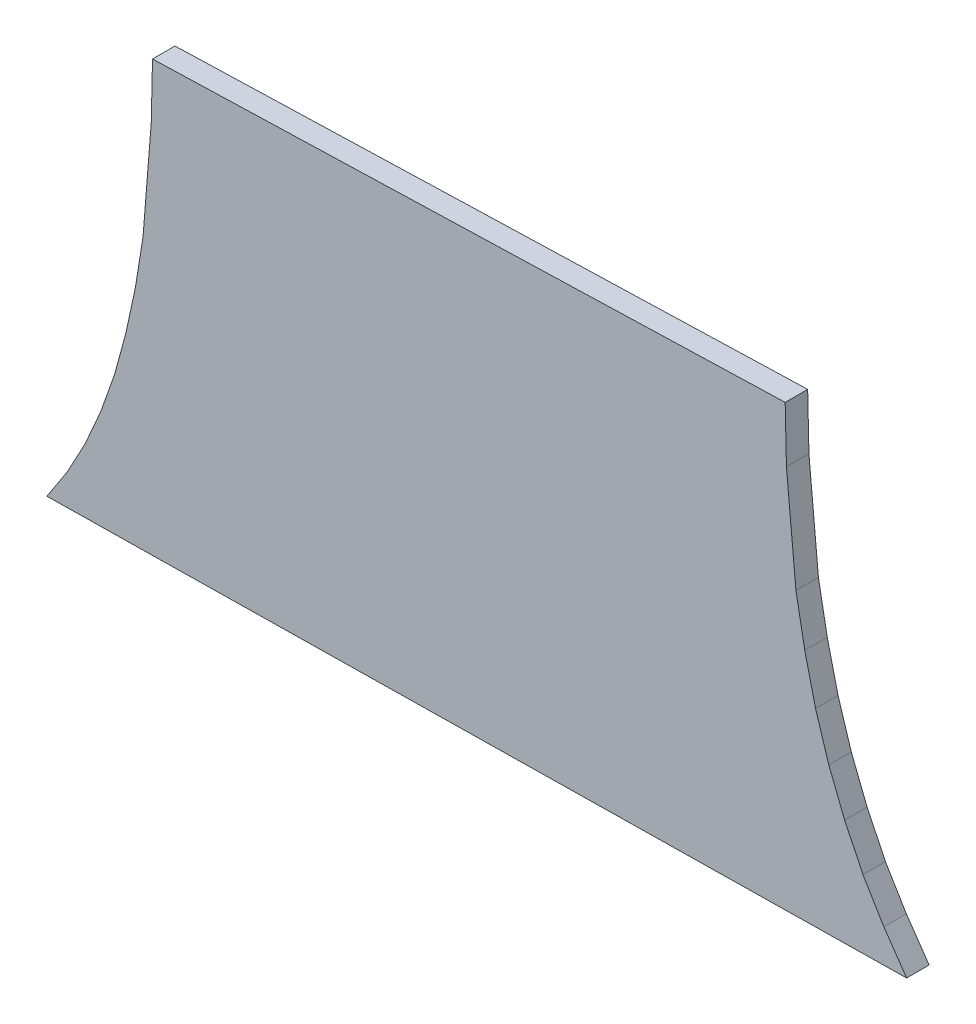
ISO-10303-21;
HEADER;
FILE_DESCRIPTION(('STEP AP214'),'2;1');
FILE_NAME('part.step','',(''),(''),'','','');
FILE_SCHEMA(('AUTOMOTIVE_DESIGN { 1 0 10303 214 1 1 1 1 }'));
ENDSEC;
DATA;
#1=APPLICATION_CONTEXT('core data for automotive mechanical design processes');
#2=APPLICATION_PROTOCOL_DEFINITION('international standard','automotive_design',2000,#1);
#3=PRODUCT_CONTEXT('',#1,'mechanical');
#4=PRODUCT('Part','Part','',(#3));
#5=PRODUCT_RELATED_PRODUCT_CATEGORY('part','',(#4));
#6=PRODUCT_DEFINITION_FORMATION('','',#4);
#7=PRODUCT_DEFINITION_CONTEXT('part definition',#1,'design');
#8=PRODUCT_DEFINITION('design','',#6,#7);
#9=PRODUCT_DEFINITION_SHAPE('','',#8);
#10=(LENGTH_UNIT() NAMED_UNIT(*) SI_UNIT(.MILLI.,.METRE.));
#11=(NAMED_UNIT(*) PLANE_ANGLE_UNIT() SI_UNIT($,.RADIAN.));
#12=(NAMED_UNIT(*) SI_UNIT($,.STERADIAN.) SOLID_ANGLE_UNIT());
#13=UNCERTAINTY_MEASURE_WITH_UNIT(LENGTH_MEASURE(1.E-05),#10,'distance_accuracy_value','');
#14=(GEOMETRIC_REPRESENTATION_CONTEXT(3) GLOBAL_UNCERTAINTY_ASSIGNED_CONTEXT((#13)) GLOBAL_UNIT_ASSIGNED_CONTEXT((#10,
#11,#12)) REPRESENTATION_CONTEXT('',''));
#15=CARTESIAN_POINT('',(0.,0.,0.));
#16=DIRECTION('',(0.,0.,1.));
#17=DIRECTION('',(1.,0.,0.));
#18=AXIS2_PLACEMENT_3D('',#15,#16,#17);
#19=CARTESIAN_POINT('',(56.9000015258789,63.7820014953613,0.));
#20=DIRECTION('',(0.999741141508267,-0.0227519224626919,0.));
#21=DIRECTION('',(-0.0227519224626919,-0.999741141508267,0.));
#22=AXIS2_PLACEMENT_3D('',#19,#20,#21);
#23=PLANE('',#22);
#24=DIRECTION('',(-0.0227519224626919,-0.999741141508266,0.));
#25=VECTOR('',#24,1.);
#26=CARTESIAN_POINT('',(56.9000015258789,63.7820014953613,0.03556));
#27=LINE('',#26,#25);
#28=CARTESIAN_POINT('',(56.9000015258789,63.7820014953613,0.03556));
#29=VERTEX_POINT('',#28);
#30=CARTESIAN_POINT('',(56.8979988098145,63.6940002441406,0.03556));
#31=VERTEX_POINT('',#30);
#32=EDGE_CURVE('E11',#29,#31,#27,.T.);
#33=ORIENTED_EDGE('',*,*,#32,.F.);
#34=DIRECTION('',(0.,0.,1.));
#35=VECTOR('',#34,1.);
#36=CARTESIAN_POINT('',(56.9000015258789,63.7820014953613,0.));
#37=LINE('',#36,#35);
#38=CARTESIAN_POINT('',(56.9000015258789,63.7820014953613,0.));
#39=VERTEX_POINT('',#38);
#40=EDGE_CURVE('E24',#39,#29,#37,.T.);
#41=ORIENTED_EDGE('',*,*,#40,.F.);
#42=DIRECTION('',(-0.0227519224626919,-0.999741141508266,0.));
#43=VECTOR('',#42,1.);
#44=CARTESIAN_POINT('',(56.9000015258789,63.7820014953613,0.));
#45=LINE('',#44,#43);
#46=CARTESIAN_POINT('',(56.8979988098145,63.6940002441406,0.));
#47=VERTEX_POINT('',#46);
#48=EDGE_CURVE('E172',#39,#47,#45,.T.);
#49=ORIENTED_EDGE('',*,*,#48,.T.);
#50=DIRECTION('',(0.,0.,1.));
#51=VECTOR('',#50,1.);
#52=CARTESIAN_POINT('',(56.8979988098145,63.6940002441406,0.));
#53=LINE('',#52,#51);
#54=EDGE_CURVE('E37',#47,#31,#53,.T.);
#55=ORIENTED_EDGE('',*,*,#54,.T.);
#56=EDGE_LOOP('',(#33,#41,#49,#55));
#57=FACE_BOUND('',#56,.T.);
#58=ADVANCED_FACE('F17',(#57),#23,.F.);
#59=CARTESIAN_POINT('',(56.8979988098145,63.6940002441406,0.));
#60=DIRECTION('',(0.996834535416527,-0.0795041445518259,0.));
#61=DIRECTION('',(-0.0795041445518259,-0.996834535416527,0.));
#62=AXIS2_PLACEMENT_3D('',#59,#60,#61);
#63=PLANE('',#62);
#64=DIRECTION('',(-0.0795041445518259,-0.996834535416526,0.));
#65=VECTOR('',#64,1.);
#66=CARTESIAN_POINT('',(56.8979988098145,63.6940002441406,0.03556));
#67=LINE('',#66,#65);
#68=CARTESIAN_POINT('',(56.8849983215332,63.5309982299805,0.03556));
#69=VERTEX_POINT('',#68);
#70=EDGE_CURVE('E308',#31,#69,#67,.T.);
#71=ORIENTED_EDGE('',*,*,#70,.F.);
#72=ORIENTED_EDGE('',*,*,#54,.F.);
#73=DIRECTION('',(-0.0795041445518259,-0.996834535416526,0.));
#74=VECTOR('',#73,1.);
#75=CARTESIAN_POINT('',(56.8979988098145,63.6940002441406,0.));
#76=LINE('',#75,#74);
#77=CARTESIAN_POINT('',(56.8849983215332,63.5309982299805,0.));
#78=VERTEX_POINT('',#77);
#79=EDGE_CURVE('E305',#47,#78,#76,.T.);
#80=ORIENTED_EDGE('',*,*,#79,.T.);
#81=DIRECTION('',(0.,0.,1.));
#82=VECTOR('',#81,1.);
#83=CARTESIAN_POINT('',(56.8849983215332,63.5309982299805,0.));
#84=LINE('',#83,#82);
#85=EDGE_CURVE('E303',#78,#69,#84,.T.);
#86=ORIENTED_EDGE('',*,*,#85,.T.);
#87=EDGE_LOOP('',(#71,#72,#80,#86));
#88=FACE_BOUND('',#87,.T.);
#89=ADVANCED_FACE('F316',(#88),#63,.F.);
#90=CARTESIAN_POINT('',(56.8849983215332,63.5309982299805,0.));
#91=DIRECTION('',(0.98744533283152,-0.157961117586731,0.));
#92=DIRECTION('',(-0.157961117586731,-0.98744533283152,0.));
#93=AXIS2_PLACEMENT_3D('',#90,#91,#92);
#94=PLANE('',#93);
#95=DIRECTION('',(-0.157961117586731,-0.98744533283152,0.));
#96=VECTOR('',#95,1.);
#97=CARTESIAN_POINT('',(56.8849983215332,63.5309982299805,0.03556));
#98=LINE('',#97,#96);
#99=CARTESIAN_POINT('',(56.8730010986328,63.4560012817383,0.03556));
#100=VERTEX_POINT('',#99);
#101=EDGE_CURVE('E300',#69,#100,#98,.T.);
#102=ORIENTED_EDGE('',*,*,#101,.F.);
#103=ORIENTED_EDGE('',*,*,#85,.F.);
#104=DIRECTION('',(-0.157961117586731,-0.98744533283152,0.));
#105=VECTOR('',#104,1.);
#106=CARTESIAN_POINT('',(56.8849983215332,63.5309982299805,0.));
#107=LINE('',#106,#105);
#108=CARTESIAN_POINT('',(56.8730010986328,63.4560012817383,0.));
#109=VERTEX_POINT('',#108);
#110=EDGE_CURVE('E297',#78,#109,#107,.T.);
#111=ORIENTED_EDGE('',*,*,#110,.T.);
#112=DIRECTION('',(0.,0.,1.));
#113=VECTOR('',#112,1.);
#114=CARTESIAN_POINT('',(56.8730010986328,63.4560012817383,0.));
#115=LINE('',#114,#113);
#116=EDGE_CURVE('E295',#109,#100,#115,.T.);
#117=ORIENTED_EDGE('',*,*,#116,.T.);
#118=EDGE_LOOP('',(#102,#103,#111,#117));
#119=FACE_BOUND('',#118,.T.);
#120=ADVANCED_FACE('F322',(#119),#94,.F.);
#121=CARTESIAN_POINT('',(56.8730010986328,63.4560012817383,0.));
#122=DIRECTION('',(0.977803973649935,-0.209521810593545,0.));
#123=DIRECTION('',(-0.209521810593545,-0.977803973649935,0.));
#124=AXIS2_PLACEMENT_3D('',#121,#122,#123);
#125=PLANE('',#124);
#126=DIRECTION('',(-0.209521810593545,-0.977803973649935,0.));
#127=VECTOR('',#126,1.);
#128=CARTESIAN_POINT('',(56.8730010986328,63.4560012817383,0.03556));
#129=LINE('',#128,#127);
#130=CARTESIAN_POINT('',(56.8580017089844,63.3860015869141,0.03556));
#131=VERTEX_POINT('',#130);
#132=EDGE_CURVE('E292',#100,#131,#129,.T.);
#133=ORIENTED_EDGE('',*,*,#132,.F.);
#134=ORIENTED_EDGE('',*,*,#116,.F.);
#135=DIRECTION('',(-0.209521810593545,-0.977803973649935,0.));
#136=VECTOR('',#135,1.);
#137=CARTESIAN_POINT('',(56.8730010986328,63.4560012817383,0.));
#138=LINE('',#137,#136);
#139=CARTESIAN_POINT('',(56.8580017089844,63.3860015869141,0.));
#140=VERTEX_POINT('',#139);
#141=EDGE_CURVE('E289',#109,#140,#138,.T.);
#142=ORIENTED_EDGE('',*,*,#141,.T.);
#143=DIRECTION('',(0.,0.,1.));
#144=VECTOR('',#143,1.);
#145=CARTESIAN_POINT('',(56.8580017089844,63.3860015869141,0.));
#146=LINE('',#145,#144);
#147=EDGE_CURVE('E287',#140,#131,#146,.T.);
#148=ORIENTED_EDGE('',*,*,#147,.T.);
#149=EDGE_LOOP('',(#133,#134,#142,#148));
#150=FACE_BOUND('',#149,.T.);
#151=ADVANCED_FACE('F324',(#150),#125,.F.);
#152=CARTESIAN_POINT('',(56.8580017089844,63.3860015869141,0.));
#153=DIRECTION('',(0.964759960824443,-0.263131560231797,0.));
#154=DIRECTION('',(-0.263131560231797,-0.964759960824443,0.));
#155=AXIS2_PLACEMENT_3D('',#152,#153,#154);
#156=PLANE('',#155);
#157=DIRECTION('',(-0.263131560231797,-0.964759960824443,0.));
#158=VECTOR('',#157,1.);
#159=CARTESIAN_POINT('',(56.8580017089844,63.3860015869141,0.03556));
#160=LINE('',#159,#158);
#161=CARTESIAN_POINT('',(56.8400001525879,63.3199996948242,0.03556));
#162=VERTEX_POINT('',#161);
#163=EDGE_CURVE('E284',#131,#162,#160,.T.);
#164=ORIENTED_EDGE('',*,*,#163,.F.);
#165=ORIENTED_EDGE('',*,*,#147,.F.);
#166=DIRECTION('',(-0.263131560231797,-0.964759960824443,0.));
#167=VECTOR('',#166,1.);
#168=CARTESIAN_POINT('',(56.8580017089844,63.3860015869141,0.));
#169=LINE('',#168,#167);
#170=CARTESIAN_POINT('',(56.8400001525879,63.3199996948242,0.));
#171=VERTEX_POINT('',#170);
#172=EDGE_CURVE('E281',#140,#171,#169,.T.);
#173=ORIENTED_EDGE('',*,*,#172,.T.);
#174=DIRECTION('',(0.,0.,1.));
#175=VECTOR('',#174,1.);
#176=CARTESIAN_POINT('',(56.8400001525879,63.3199996948242,0.));
#177=LINE('',#176,#175);
#178=EDGE_CURVE('E279',#171,#162,#177,.T.);
#179=ORIENTED_EDGE('',*,*,#178,.T.);
#180=EDGE_LOOP('',(#164,#165,#173,#179));
#181=FACE_BOUND('',#180,.T.);
#182=ADVANCED_FACE('F329',(#181),#156,.F.);
#183=CARTESIAN_POINT('',(56.8400001525879,63.3199996948242,0.));
#184=DIRECTION('',(0.942431282410395,-0.334399877294084,0.));
#185=DIRECTION('',(-0.334399877294084,-0.942431282410395,0.));
#186=AXIS2_PLACEMENT_3D('',#183,#184,#185);
#187=PLANE('',#186);
#188=DIRECTION('',(-0.334399877294084,-0.942431282410395,0.));
#189=VECTOR('',#188,1.);
#190=CARTESIAN_POINT('',(56.8400001525879,63.3199996948242,0.03556));
#191=LINE('',#190,#189);
#192=CARTESIAN_POINT('',(56.818000793457,63.257999420166,0.03556));
#193=VERTEX_POINT('',#192);
#194=EDGE_CURVE('E276',#162,#193,#191,.T.);
#195=ORIENTED_EDGE('',*,*,#194,.F.);
#196=ORIENTED_EDGE('',*,*,#178,.F.);
#197=DIRECTION('',(-0.334399877294084,-0.942431282410395,0.));
#198=VECTOR('',#197,1.);
#199=CARTESIAN_POINT('',(56.8400001525879,63.3199996948242,0.));
#200=LINE('',#199,#198);
#201=CARTESIAN_POINT('',(56.818000793457,63.257999420166,0.));
#202=VERTEX_POINT('',#201);
#203=EDGE_CURVE('E273',#171,#202,#200,.T.);
#204=ORIENTED_EDGE('',*,*,#203,.T.);
#205=DIRECTION('',(0.,0.,1.));
#206=VECTOR('',#205,1.);
#207=CARTESIAN_POINT('',(56.818000793457,63.257999420166,0.));
#208=LINE('',#207,#206);
#209=EDGE_CURVE('E271',#202,#193,#208,.T.);
#210=ORIENTED_EDGE('',*,*,#209,.T.);
#211=EDGE_LOOP('',(#195,#196,#204,#210));
#212=FACE_BOUND('',#211,.T.);
#213=ADVANCED_FACE('F332',(#212),#187,.F.);
#214=CARTESIAN_POINT('',(56.818000793457,63.257999420166,0.));
#215=DIRECTION('',(0.915777134064196,-0.401686744522604,0.));
#216=DIRECTION('',(-0.401686744522604,-0.915777134064196,0.));
#217=AXIS2_PLACEMENT_3D('',#214,#215,#216);
#218=PLANE('',#217);
#219=DIRECTION('',(-0.401686744522604,-0.915777134064196,0.));
#220=VECTOR('',#219,1.);
#221=CARTESIAN_POINT('',(56.818000793457,63.257999420166,0.03556));
#222=LINE('',#221,#220);
#223=CARTESIAN_POINT('',(56.7929992675781,63.201000213623,0.03556));
#224=VERTEX_POINT('',#223);
#225=EDGE_CURVE('E268',#193,#224,#222,.T.);
#226=ORIENTED_EDGE('',*,*,#225,.F.);
#227=ORIENTED_EDGE('',*,*,#209,.F.);
#228=DIRECTION('',(-0.401686744522604,-0.915777134064196,0.));
#229=VECTOR('',#228,1.);
#230=CARTESIAN_POINT('',(56.818000793457,63.257999420166,0.));
#231=LINE('',#230,#229);
#232=CARTESIAN_POINT('',(56.7929992675781,63.201000213623,0.));
#233=VERTEX_POINT('',#232);
#234=EDGE_CURVE('E265',#202,#233,#231,.T.);
#235=ORIENTED_EDGE('',*,*,#234,.T.);
#236=DIRECTION('',(0.,0.,1.));
#237=VECTOR('',#236,1.);
#238=CARTESIAN_POINT('',(56.7929992675781,63.201000213623,0.));
#239=LINE('',#238,#237);
#240=EDGE_CURVE('E263',#233,#224,#239,.T.);
#241=ORIENTED_EDGE('',*,*,#240,.T.);
#242=EDGE_LOOP('',(#226,#227,#235,#241));
#243=FACE_BOUND('',#242,.T.);
#244=ADVANCED_FACE('F337',(#243),#218,.F.);
#245=CARTESIAN_POINT('',(56.7929992675781,63.201000213623,0.));
#246=DIRECTION('',(0.88047939564248,-0.474084416374399,0.));
#247=DIRECTION('',(-0.474084416374399,-0.88047939564248,0.));
#248=AXIS2_PLACEMENT_3D('',#245,#246,#247);
#249=PLANE('',#248);
#250=DIRECTION('',(-0.474084416374398,-0.88047939564248,0.));
#251=VECTOR('',#250,1.);
#252=CARTESIAN_POINT('',(56.7929992675781,63.201000213623,0.03556));
#253=LINE('',#252,#251);
#254=CARTESIAN_POINT('',(56.7649993896484,63.1489982604981,0.03556));
#255=VERTEX_POINT('',#254);
#256=EDGE_CURVE('E260',#224,#255,#253,.T.);
#257=ORIENTED_EDGE('',*,*,#256,.F.);
#258=ORIENTED_EDGE('',*,*,#240,.F.);
#259=DIRECTION('',(-0.474084416374398,-0.88047939564248,0.));
#260=VECTOR('',#259,1.);
#261=CARTESIAN_POINT('',(56.7929992675781,63.201000213623,0.));
#262=LINE('',#261,#260);
#263=CARTESIAN_POINT('',(56.7649993896484,63.1489982604981,0.));
#264=VERTEX_POINT('',#263);
#265=EDGE_CURVE('E257',#233,#264,#262,.T.);
#266=ORIENTED_EDGE('',*,*,#265,.T.);
#267=DIRECTION('',(0.,0.,1.));
#268=VECTOR('',#267,1.);
#269=CARTESIAN_POINT('',(56.7649993896484,63.1489982604981,0.));
#270=LINE('',#269,#268);
#271=EDGE_CURVE('E255',#264,#255,#270,.T.);
#272=ORIENTED_EDGE('',*,*,#271,.T.);
#273=EDGE_LOOP('',(#257,#258,#266,#272));
#274=FACE_BOUND('',#273,.T.);
#275=ADVANCED_FACE('F340',(#274),#249,.F.);
#276=CARTESIAN_POINT('',(56.7649993896484,63.1489982604981,0.));
#277=DIRECTION('',(0.83728755665149,-0.546762789037968,0.));
#278=DIRECTION('',(-0.546762789037968,-0.83728755665149,0.));
#279=AXIS2_PLACEMENT_3D('',#276,#277,#278);
#280=PLANE('',#279);
#281=DIRECTION('',(-0.546762789037968,-0.83728755665149,0.));
#282=VECTOR('',#281,1.);
#283=CARTESIAN_POINT('',(56.7649993896484,63.1489982604981,0.03556));
#284=LINE('',#283,#282);
#285=CARTESIAN_POINT('',(56.7330017089844,63.0999984741211,0.03556));
#286=VERTEX_POINT('',#285);
#287=EDGE_CURVE('E252',#255,#286,#284,.T.);
#288=ORIENTED_EDGE('',*,*,#287,.F.);
#289=ORIENTED_EDGE('',*,*,#271,.F.);
#290=DIRECTION('',(-0.546762789037968,-0.83728755665149,0.));
#291=VECTOR('',#290,1.);
#292=CARTESIAN_POINT('',(56.7649993896484,63.1489982604981,0.));
#293=LINE('',#292,#291);
#294=CARTESIAN_POINT('',(56.7330017089844,63.0999984741211,0.));
#295=VERTEX_POINT('',#294);
#296=EDGE_CURVE('E249',#264,#295,#293,.T.);
#297=ORIENTED_EDGE('',*,*,#296,.T.);
#298=DIRECTION('',(0.,0.,1.));
#299=VECTOR('',#298,1.);
#300=CARTESIAN_POINT('',(56.7330017089844,63.0999984741211,0.));
#301=LINE('',#300,#299);
#302=EDGE_CURVE('E247',#295,#286,#301,.T.);
#303=ORIENTED_EDGE('',*,*,#302,.T.);
#304=EDGE_LOOP('',(#288,#289,#297,#303));
#305=FACE_BOUND('',#304,.T.);
#306=ADVANCED_FACE('F345',(#305),#280,.F.);
#307=CARTESIAN_POINT('',(56.7330017089844,63.0999984741211,0.));
#308=DIRECTION('',(-0.0147154755074968,0.99989172152818,0.));
#309=DIRECTION('',(0.99989172152818,0.0147154755074968,0.));
#310=AXIS2_PLACEMENT_3D('',#307,#308,#309);
#311=PLANE('',#310);
#312=DIRECTION('',(0.99989172152818,0.0147154755074968,0.));
#313=VECTOR('',#312,1.);
#314=CARTESIAN_POINT('',(56.7330017089844,63.0999984741211,0.03556));
#315=LINE('',#314,#313);
#316=CARTESIAN_POINT('',(58.0919990539551,63.1199989318848,0.03556));
#317=VERTEX_POINT('',#316);
#318=EDGE_CURVE('E244',#286,#317,#315,.T.);
#319=ORIENTED_EDGE('',*,*,#318,.F.);
#320=ORIENTED_EDGE('',*,*,#302,.F.);
#321=DIRECTION('',(0.99989172152818,0.0147154755074968,0.));
#322=VECTOR('',#321,1.);
#323=CARTESIAN_POINT('',(56.7330017089844,63.0999984741211,0.));
#324=LINE('',#323,#322);
#325=CARTESIAN_POINT('',(58.0919990539551,63.1199989318848,0.));
#326=VERTEX_POINT('',#325);
#327=EDGE_CURVE('E241',#295,#326,#324,.T.);
#328=ORIENTED_EDGE('',*,*,#327,.T.);
#329=DIRECTION('',(0.,0.,1.));
#330=VECTOR('',#329,1.);
#331=CARTESIAN_POINT('',(58.0919990539551,63.1199989318848,0.));
#332=LINE('',#331,#330);
#333=EDGE_CURVE('E239',#326,#317,#332,.T.);
#334=ORIENTED_EDGE('',*,*,#333,.T.);
#335=EDGE_LOOP('',(#319,#320,#328,#334));
#336=FACE_BOUND('',#335,.T.);
#337=ADVANCED_FACE('F348',(#336),#311,.F.);
#338=CARTESIAN_POINT('',(58.0919990539551,63.1199989318848,0.));
#339=DIRECTION('',(-0.822207390607001,-0.569188024146,0.));
#340=DIRECTION('',(-0.569188024146,0.822207390607001,0.));
#341=AXIS2_PLACEMENT_3D('',#338,#339,#340);
#342=PLANE('',#341);
#343=DIRECTION('',(-0.569188024146,0.822207390607001,0.));
#344=VECTOR('',#343,1.);
#345=CARTESIAN_POINT('',(58.0919990539551,63.1199989318848,0.03556));
#346=LINE('',#345,#344);
#347=CARTESIAN_POINT('',(58.0559997558594,63.1720008850098,0.03556));
#348=VERTEX_POINT('',#347);
#349=EDGE_CURVE('E236',#317,#348,#346,.T.);
#350=ORIENTED_EDGE('',*,*,#349,.F.);
#351=ORIENTED_EDGE('',*,*,#333,.F.);
#352=DIRECTION('',(-0.569188024146,0.822207390607001,0.));
#353=VECTOR('',#352,1.);
#354=CARTESIAN_POINT('',(58.0919990539551,63.1199989318848,0.));
#355=LINE('',#354,#353);
#356=CARTESIAN_POINT('',(58.0559997558594,63.1720008850098,0.));
#357=VERTEX_POINT('',#356);
#358=EDGE_CURVE('E233',#326,#357,#355,.T.);
#359=ORIENTED_EDGE('',*,*,#358,.T.);
#360=DIRECTION('',(0.,0.,1.));
#361=VECTOR('',#360,1.);
#362=CARTESIAN_POINT('',(58.0559997558594,63.1720008850098,0.));
#363=LINE('',#362,#361);
#364=EDGE_CURVE('E231',#357,#348,#363,.T.);
#365=ORIENTED_EDGE('',*,*,#364,.T.);
#366=EDGE_LOOP('',(#350,#351,#359,#365));
#367=FACE_BOUND('',#366,.T.);
#368=ADVANCED_FACE('F353',(#367),#342,.F.);
#369=CARTESIAN_POINT('',(58.0559997558594,63.1720008850098,0.));
#370=DIRECTION('',(-0.857487678013795,-0.514504501491007,0.));
#371=DIRECTION('',(-0.514504501491007,0.857487678013795,0.));
#372=AXIS2_PLACEMENT_3D('',#369,#370,#371);
#373=PLANE('',#372);
#374=DIRECTION('',(-0.514504501491007,0.857487678013795,0.));
#375=VECTOR('',#374,1.);
#376=CARTESIAN_POINT('',(58.0559997558594,63.1720008850098,0.03556));
#377=LINE('',#376,#375);
#378=CARTESIAN_POINT('',(58.0229988098145,63.2270011901856,0.03556));
#379=VERTEX_POINT('',#378);
#380=EDGE_CURVE('E228',#348,#379,#377,.T.);
#381=ORIENTED_EDGE('',*,*,#380,.F.);
#382=ORIENTED_EDGE('',*,*,#364,.F.);
#383=DIRECTION('',(-0.514504501491007,0.857487678013795,0.));
#384=VECTOR('',#383,1.);
#385=CARTESIAN_POINT('',(58.0559997558594,63.1720008850098,0.));
#386=LINE('',#385,#384);
#387=CARTESIAN_POINT('',(58.0229988098145,63.2270011901856,0.));
#388=VERTEX_POINT('',#387);
#389=EDGE_CURVE('E225',#357,#388,#386,.T.);
#390=ORIENTED_EDGE('',*,*,#389,.T.);
#391=DIRECTION('',(0.,0.,1.));
#392=VECTOR('',#391,1.);
#393=CARTESIAN_POINT('',(58.0229988098145,63.2270011901856,0.));
#394=LINE('',#393,#392);
#395=EDGE_CURVE('E223',#388,#379,#394,.T.);
#396=ORIENTED_EDGE('',*,*,#395,.T.);
#397=EDGE_LOOP('',(#381,#382,#390,#396));
#398=FACE_BOUND('',#397,.T.);
#399=ADVANCED_FACE('F356',(#398),#373,.F.);
#400=CARTESIAN_POINT('',(58.0229988098145,63.2270011901856,0.));
#401=DIRECTION('',(-0.900345962325327,-0.435174847761771,0.));
#402=DIRECTION('',(-0.435174847761771,0.900345962325327,0.));
#403=AXIS2_PLACEMENT_3D('',#400,#401,#402);
#404=PLANE('',#403);
#405=DIRECTION('',(-0.435174847761771,0.900345962325327,0.));
#406=VECTOR('',#405,1.);
#407=CARTESIAN_POINT('',(58.0229988098145,63.2270011901856,0.03556));
#408=LINE('',#407,#406);
#409=CARTESIAN_POINT('',(57.9939994812012,63.2869987487793,0.03556));
#410=VERTEX_POINT('',#409);
#411=EDGE_CURVE('E220',#379,#410,#408,.T.);
#412=ORIENTED_EDGE('',*,*,#411,.F.);
#413=ORIENTED_EDGE('',*,*,#395,.F.);
#414=DIRECTION('',(-0.435174847761771,0.900345962325327,0.));
#415=VECTOR('',#414,1.);
#416=CARTESIAN_POINT('',(58.0229988098145,63.2270011901856,0.));
#417=LINE('',#416,#415);
#418=CARTESIAN_POINT('',(57.9939994812012,63.2869987487793,0.));
#419=VERTEX_POINT('',#418);
#420=EDGE_CURVE('E217',#388,#419,#417,.T.);
#421=ORIENTED_EDGE('',*,*,#420,.T.);
#422=DIRECTION('',(0.,0.,1.));
#423=VECTOR('',#422,1.);
#424=CARTESIAN_POINT('',(57.9939994812012,63.2869987487793,0.));
#425=LINE('',#424,#423);
#426=EDGE_CURVE('E215',#419,#410,#425,.T.);
#427=ORIENTED_EDGE('',*,*,#426,.T.);
#428=EDGE_LOOP('',(#412,#413,#421,#427));
#429=FACE_BOUND('',#428,.T.);
#430=ADVANCED_FACE('F361',(#429),#404,.F.);
#431=CARTESIAN_POINT('',(57.9939994812012,63.2869987487793,0.));
#432=DIRECTION('',(-0.929501736885279,-0.368817734290598,0.));
#433=DIRECTION('',(-0.368817734290598,0.929501736885278,0.));
#434=AXIS2_PLACEMENT_3D('',#431,#432,#433);
#435=PLANE('',#434);
#436=DIRECTION('',(-0.368817734290598,0.929501736885279,0.));
#437=VECTOR('',#436,1.);
#438=CARTESIAN_POINT('',(57.9939994812012,63.2869987487793,0.03556));
#439=LINE('',#438,#437);
#440=CARTESIAN_POINT('',(57.9690017700195,63.3499984741211,0.03556));
#441=VERTEX_POINT('',#440);
#442=EDGE_CURVE('E212',#410,#441,#439,.T.);
#443=ORIENTED_EDGE('',*,*,#442,.F.);
#444=ORIENTED_EDGE('',*,*,#426,.F.);
#445=DIRECTION('',(-0.368817734290598,0.929501736885279,0.));
#446=VECTOR('',#445,1.);
#447=CARTESIAN_POINT('',(57.9939994812012,63.2869987487793,0.));
#448=LINE('',#447,#446);
#449=CARTESIAN_POINT('',(57.9690017700195,63.3499984741211,0.));
#450=VERTEX_POINT('',#449);
#451=EDGE_CURVE('E209',#419,#450,#448,.T.);
#452=ORIENTED_EDGE('',*,*,#451,.T.);
#453=DIRECTION('',(0.,0.,1.));
#454=VECTOR('',#453,1.);
#455=CARTESIAN_POINT('',(57.9690017700195,63.3499984741211,0.));
#456=LINE('',#455,#454);
#457=EDGE_CURVE('E207',#450,#441,#456,.T.);
#458=ORIENTED_EDGE('',*,*,#457,.T.);
#459=EDGE_LOOP('',(#443,#444,#452,#458));
#460=FACE_BOUND('',#459,.T.);
#461=ADVANCED_FACE('F364',(#460),#435,.F.);
#462=CARTESIAN_POINT('',(57.9690017700195,63.3499984741211,0.));
#463=DIRECTION('',(-0.954228296684143,-0.299079183172751,0.));
#464=DIRECTION('',(-0.299079183172751,0.954228296684143,0.));
#465=AXIS2_PLACEMENT_3D('',#462,#463,#464);
#466=PLANE('',#465);
#467=DIRECTION('',(-0.299079183172751,0.954228296684143,0.));
#468=VECTOR('',#467,1.);
#469=CARTESIAN_POINT('',(57.9690017700195,63.3499984741211,0.03556));
#470=LINE('',#469,#468);
#471=CARTESIAN_POINT('',(57.9480018615723,63.4169998168945,0.03556));
#472=VERTEX_POINT('',#471);
#473=EDGE_CURVE('E204',#441,#472,#470,.T.);
#474=ORIENTED_EDGE('',*,*,#473,.F.);
#475=ORIENTED_EDGE('',*,*,#457,.F.);
#476=DIRECTION('',(-0.299079183172751,0.954228296684143,0.));
#477=VECTOR('',#476,1.);
#478=CARTESIAN_POINT('',(57.9690017700195,63.3499984741211,0.));
#479=LINE('',#478,#477);
#480=CARTESIAN_POINT('',(57.9480018615723,63.4169998168945,0.));
#481=VERTEX_POINT('',#480);
#482=EDGE_CURVE('E201',#450,#481,#479,.T.);
#483=ORIENTED_EDGE('',*,*,#482,.T.);
#484=DIRECTION('',(0.,0.,1.));
#485=VECTOR('',#484,1.);
#486=CARTESIAN_POINT('',(57.9480018615723,63.4169998168945,0.));
#487=LINE('',#486,#485);
#488=EDGE_CURVE('E199',#481,#472,#487,.T.);
#489=ORIENTED_EDGE('',*,*,#488,.T.);
#490=EDGE_LOOP('',(#474,#475,#483,#489));
#491=FACE_BOUND('',#490,.T.);
#492=ADVANCED_FACE('F369',(#491),#466,.F.);
#493=CARTESIAN_POINT('',(57.9480018615723,63.4169998168945,0.));
#494=DIRECTION('',(-0.972504330258907,-0.232884794754134,0.));
#495=DIRECTION('',(-0.232884794754134,0.972504330258907,0.));
#496=AXIS2_PLACEMENT_3D('',#493,#494,#495);
#497=PLANE('',#496);
#498=DIRECTION('',(-0.232884794754134,0.972504330258907,0.));
#499=VECTOR('',#498,1.);
#500=CARTESIAN_POINT('',(57.9480018615723,63.4169998168945,0.03556));
#501=LINE('',#500,#499);
#502=CARTESIAN_POINT('',(57.9309997558594,63.4879989624023,0.03556));
#503=VERTEX_POINT('',#502);
#504=EDGE_CURVE('E196',#472,#503,#501,.T.);
#505=ORIENTED_EDGE('',*,*,#504,.F.);
#506=ORIENTED_EDGE('',*,*,#488,.F.);
#507=DIRECTION('',(-0.232884794754134,0.972504330258907,0.));
#508=VECTOR('',#507,1.);
#509=CARTESIAN_POINT('',(57.9480018615723,63.4169998168945,0.));
#510=LINE('',#509,#508);
#511=CARTESIAN_POINT('',(57.9309997558594,63.4879989624023,0.));
#512=VERTEX_POINT('',#511);
#513=EDGE_CURVE('E193',#481,#512,#510,.T.);
#514=ORIENTED_EDGE('',*,*,#513,.T.);
#515=DIRECTION('',(0.,0.,1.));
#516=VECTOR('',#515,1.);
#517=CARTESIAN_POINT('',(57.9309997558594,63.4879989624023,0.));
#518=LINE('',#517,#516);
#519=EDGE_CURVE('E191',#512,#503,#518,.T.);
#520=ORIENTED_EDGE('',*,*,#519,.T.);
#521=EDGE_LOOP('',(#505,#506,#514,#520));
#522=FACE_BOUND('',#521,.T.);
#523=ADVANCED_FACE('F372',(#522),#497,.F.);
#524=CARTESIAN_POINT('',(57.9309997558594,63.4879989624023,0.));
#525=DIRECTION('',(-0.983020729764768,-0.183494536302157,0.));
#526=DIRECTION('',(-0.183494536302157,0.983020729764768,0.));
#527=AXIS2_PLACEMENT_3D('',#524,#525,#526);
#528=PLANE('',#527);
#529=DIRECTION('',(-0.183494536302156,0.983020729764768,0.));
#530=VECTOR('',#529,1.);
#531=CARTESIAN_POINT('',(57.9309997558594,63.4879989624023,0.03556));
#532=LINE('',#531,#530);
#533=CARTESIAN_POINT('',(57.9169998168945,63.5629997253418,0.03556));
#534=VERTEX_POINT('',#533);
#535=EDGE_CURVE('E188',#503,#534,#532,.T.);
#536=ORIENTED_EDGE('',*,*,#535,.F.);
#537=ORIENTED_EDGE('',*,*,#519,.F.);
#538=DIRECTION('',(-0.183494536302156,0.983020729764768,0.));
#539=VECTOR('',#538,1.);
#540=CARTESIAN_POINT('',(57.9309997558594,63.4879989624023,0.));
#541=LINE('',#540,#539);
#542=CARTESIAN_POINT('',(57.9169998168945,63.5629997253418,0.));
#543=VERTEX_POINT('',#542);
#544=EDGE_CURVE('E185',#512,#543,#541,.T.);
#545=ORIENTED_EDGE('',*,*,#544,.T.);
#546=DIRECTION('',(0.,0.,1.));
#547=VECTOR('',#546,1.);
#548=CARTESIAN_POINT('',(57.9169998168945,63.5629997253418,0.));
#549=LINE('',#548,#547);
#550=EDGE_CURVE('E183',#543,#534,#549,.T.);
#551=ORIENTED_EDGE('',*,*,#550,.T.);
#552=EDGE_LOOP('',(#536,#537,#545,#551));
#553=FACE_BOUND('',#552,.T.);
#554=ADVANCED_FACE('F377',(#553),#528,.F.);
#555=CARTESIAN_POINT('',(57.9169998168945,63.5629997253418,0.));
#556=DIRECTION('',(-0.995740953092253,-0.0921951969189898,0.));
#557=DIRECTION('',(-0.0921951969189898,0.995740953092253,0.));
#558=AXIS2_PLACEMENT_3D('',#555,#556,#557);
#559=PLANE('',#558);
#560=DIRECTION('',(-0.0921951969189898,0.995740953092253,0.));
#561=VECTOR('',#560,1.);
#562=CARTESIAN_POINT('',(57.9169998168945,63.5629997253418,0.03556));
#563=LINE('',#562,#561);
#564=CARTESIAN_POINT('',(57.9020004272461,63.7249984741211,0.03556));
#565=VERTEX_POINT('',#564);
#566=EDGE_CURVE('E180',#534,#565,#563,.T.);
#567=ORIENTED_EDGE('',*,*,#566,.F.);
#568=ORIENTED_EDGE('',*,*,#550,.F.);
#569=DIRECTION('',(-0.0921951969189898,0.995740953092253,0.));
#570=VECTOR('',#569,1.);
#571=CARTESIAN_POINT('',(57.9169998168945,63.5629997253418,0.));
#572=LINE('',#571,#570);
#573=CARTESIAN_POINT('',(57.9020004272461,63.7249984741211,0.));
#574=VERTEX_POINT('',#573);
#575=EDGE_CURVE('E178',#543,#574,#572,.T.);
#576=ORIENTED_EDGE('',*,*,#575,.T.);
#577=DIRECTION('',(0.,0.,1.));
#578=VECTOR('',#577,1.);
#579=CARTESIAN_POINT('',(57.9020004272461,63.7249984741211,0.));
#580=LINE('',#579,#578);
#581=EDGE_CURVE('E163',#574,#565,#580,.T.);
#582=ORIENTED_EDGE('',*,*,#581,.T.);
#583=EDGE_LOOP('',(#567,#568,#576,#582));
#584=FACE_BOUND('',#583,.T.);
#585=ADVANCED_FACE('F379',(#584),#559,.F.);
#586=CARTESIAN_POINT('',(57.9020004272461,63.7249984741211,0.));
#587=DIRECTION('',(-0.999736169891065,-0.0229693406858823,0.));
#588=DIRECTION('',(-0.0229693406858823,0.999736169891065,0.));
#589=AXIS2_PLACEMENT_3D('',#586,#587,#588);
#590=PLANE('',#589);
#591=DIRECTION('',(-0.0229693406858823,0.999736169891065,0.));
#592=VECTOR('',#591,1.);
#593=CARTESIAN_POINT('',(57.9020004272461,63.7249984741211,0.03556));
#594=LINE('',#593,#592);
#595=CARTESIAN_POINT('',(57.9000015258789,63.8120002746582,0.03556));
#596=VERTEX_POINT('',#595);
#597=EDGE_CURVE('E167',#565,#596,#594,.T.);
#598=ORIENTED_EDGE('',*,*,#597,.F.);
#599=ORIENTED_EDGE('',*,*,#581,.F.);
#600=DIRECTION('',(-0.0229693406858823,0.999736169891065,0.));
#601=VECTOR('',#600,1.);
#602=CARTESIAN_POINT('',(57.9020004272461,63.7249984741211,0.));
#603=LINE('',#602,#601);
#604=CARTESIAN_POINT('',(57.9000015258789,63.8120002746582,0.));
#605=VERTEX_POINT('',#604);
#606=EDGE_CURVE('E159',#574,#605,#603,.T.);
#607=ORIENTED_EDGE('',*,*,#606,.T.);
#608=DIRECTION('',(0.,0.,1.));
#609=VECTOR('',#608,1.);
#610=CARTESIAN_POINT('',(57.9000015258789,63.8120002746582,0.));
#611=LINE('',#610,#609);
#612=EDGE_CURVE('E149',#605,#596,#611,.T.);
#613=ORIENTED_EDGE('',*,*,#612,.T.);
#614=EDGE_LOOP('',(#598,#599,#607,#613));
#615=FACE_BOUND('',#614,.T.);
#616=ADVANCED_FACE('F162',(#615),#590,.F.);
#617=CARTESIAN_POINT('',(57.9000015258789,63.8120002746582,0.));
#618=DIRECTION('',(0.0299852900485763,-0.999550340093335,0.));
#619=DIRECTION('',(-0.999550340093335,-0.0299852900485763,0.));
#620=AXIS2_PLACEMENT_3D('',#617,#618,#619);
#621=PLANE('',#620);
#622=DIRECTION('',(-0.999550340093335,-0.0299852900485763,0.));
#623=VECTOR('',#622,1.);
#624=CARTESIAN_POINT('',(57.9000015258789,63.8120002746582,0.03556));
#625=LINE('',#624,#623);
#626=EDGE_CURVE('E155',#596,#29,#625,.T.);
#627=ORIENTED_EDGE('',*,*,#626,.F.);
#628=ORIENTED_EDGE('',*,*,#612,.F.);
#629=DIRECTION('',(-0.999550340093335,-0.0299852900485763,0.));
#630=VECTOR('',#629,1.);
#631=CARTESIAN_POINT('',(57.9000015258789,63.8120002746582,0.));
#632=LINE('',#631,#630);
#633=EDGE_CURVE('E153',#605,#39,#632,.T.);
#634=ORIENTED_EDGE('',*,*,#633,.T.);
#635=ORIENTED_EDGE('',*,*,#40,.T.);
#636=EDGE_LOOP('',(#627,#628,#634,#635));
#637=FACE_BOUND('',#636,.T.);
#638=ADVANCED_FACE('F151',(#637),#621,.F.);
#639=CARTESIAN_POINT('',(56.9000015258789,63.7820014953613,0.));
#640=DIRECTION('',(0.,0.,1.));
#641=DIRECTION('',(1.,0.,0.));
#642=AXIS2_PLACEMENT_3D('',#639,#640,#641);
#643=PLANE('',#642);
#644=ORIENTED_EDGE('',*,*,#633,.F.);
#645=ORIENTED_EDGE('',*,*,#606,.F.);
#646=ORIENTED_EDGE('',*,*,#575,.F.);
#647=ORIENTED_EDGE('',*,*,#544,.F.);
#648=ORIENTED_EDGE('',*,*,#513,.F.);
#649=ORIENTED_EDGE('',*,*,#482,.F.);
#650=ORIENTED_EDGE('',*,*,#451,.F.);
#651=ORIENTED_EDGE('',*,*,#420,.F.);
#652=ORIENTED_EDGE('',*,*,#389,.F.);
#653=ORIENTED_EDGE('',*,*,#358,.F.);
#654=ORIENTED_EDGE('',*,*,#327,.F.);
#655=ORIENTED_EDGE('',*,*,#296,.F.);
#656=ORIENTED_EDGE('',*,*,#265,.F.);
#657=ORIENTED_EDGE('',*,*,#234,.F.);
#658=ORIENTED_EDGE('',*,*,#203,.F.);
#659=ORIENTED_EDGE('',*,*,#172,.F.);
#660=ORIENTED_EDGE('',*,*,#141,.F.);
#661=ORIENTED_EDGE('',*,*,#110,.F.);
#662=ORIENTED_EDGE('',*,*,#79,.F.);
#663=ORIENTED_EDGE('',*,*,#48,.F.);
#664=EDGE_LOOP('',(#644,#645,#646,#647,#648,#649,#650,#651,#652,#653,#654,#655,#656,#657,#658,
#659,#660,#661,#662,#663));
#665=FACE_BOUND('',#664,.T.);
#666=ADVANCED_FACE('F170',(#665),#643,.F.);
#667=CARTESIAN_POINT('',(56.9000015258789,63.7820014953613,0.03556));
#668=DIRECTION('',(0.,0.,1.));
#669=DIRECTION('',(1.,0.,0.));
#670=AXIS2_PLACEMENT_3D('',#667,#668,#669);
#671=PLANE('',#670);
#672=ORIENTED_EDGE('',*,*,#32,.T.);
#673=ORIENTED_EDGE('',*,*,#70,.T.);
#674=ORIENTED_EDGE('',*,*,#101,.T.);
#675=ORIENTED_EDGE('',*,*,#132,.T.);
#676=ORIENTED_EDGE('',*,*,#163,.T.);
#677=ORIENTED_EDGE('',*,*,#194,.T.);
#678=ORIENTED_EDGE('',*,*,#225,.T.);
#679=ORIENTED_EDGE('',*,*,#256,.T.);
#680=ORIENTED_EDGE('',*,*,#287,.T.);
#681=ORIENTED_EDGE('',*,*,#318,.T.);
#682=ORIENTED_EDGE('',*,*,#349,.T.);
#683=ORIENTED_EDGE('',*,*,#380,.T.);
#684=ORIENTED_EDGE('',*,*,#411,.T.);
#685=ORIENTED_EDGE('',*,*,#442,.T.);
#686=ORIENTED_EDGE('',*,*,#473,.T.);
#687=ORIENTED_EDGE('',*,*,#504,.T.);
#688=ORIENTED_EDGE('',*,*,#535,.T.);
#689=ORIENTED_EDGE('',*,*,#566,.T.);
#690=ORIENTED_EDGE('',*,*,#597,.T.);
#691=ORIENTED_EDGE('',*,*,#626,.T.);
#692=EDGE_LOOP('',(#672,#673,#674,#675,#676,#677,#678,#679,#680,#681,#682,#683,#684,#685,#686,
#687,#688,#689,#690,#691));
#693=FACE_BOUND('',#692,.T.);
#694=ADVANCED_FACE('F319',(#693),#671,.T.);
#695=CLOSED_SHELL('',(#58,#89,#120,#151,#182,#213,#244,#275,#306,#337,#368,#399,#430,#461,#492,
#523,#554,#585,#616,#638,#666,#694));
#696=MANIFOLD_SOLID_BREP('B1',#695);
#697=ADVANCED_BREP_SHAPE_REPRESENTATION('',(#18,#696),#14);
#698=SHAPE_DEFINITION_REPRESENTATION(#9,#697);
ENDSEC;
END-ISO-10303-21;
